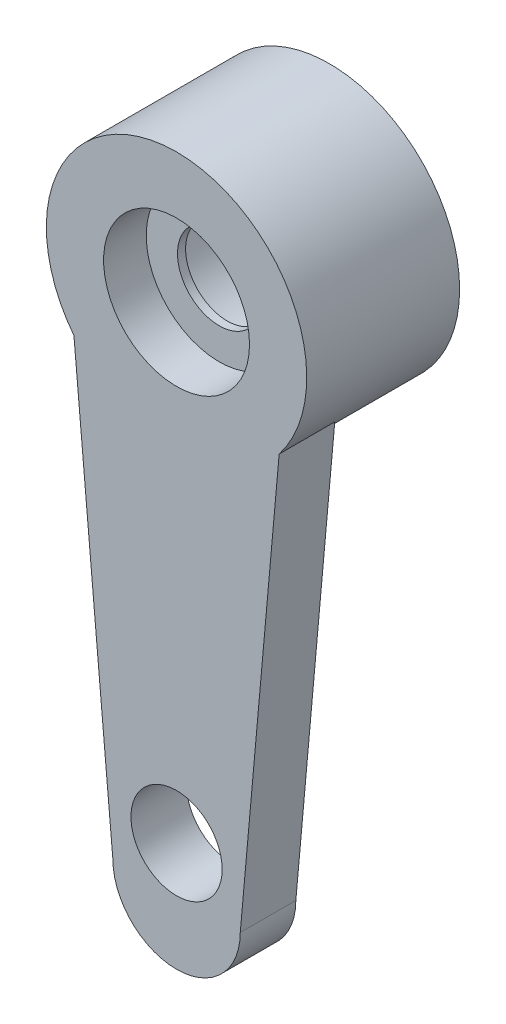
ISO-10303-21;
HEADER;
FILE_DESCRIPTION(('STEP AP214'),'2;1');
FILE_NAME('part.step','',(''),(''),'','','');
FILE_SCHEMA(('AUTOMOTIVE_DESIGN { 1 0 10303 214 1 1 1 1 }'));
ENDSEC;
DATA;
#1=APPLICATION_CONTEXT('core data for automotive mechanical design processes');
#2=APPLICATION_PROTOCOL_DEFINITION('international standard','automotive_design',2000,#1);
#3=PRODUCT_CONTEXT('',#1,'mechanical');
#4=PRODUCT('Part','Part','',(#3));
#5=PRODUCT_RELATED_PRODUCT_CATEGORY('part','',(#4));
#6=PRODUCT_DEFINITION_FORMATION('','',#4);
#7=PRODUCT_DEFINITION_CONTEXT('part definition',#1,'design');
#8=PRODUCT_DEFINITION('design','',#6,#7);
#9=PRODUCT_DEFINITION_SHAPE('','',#8);
#10=(LENGTH_UNIT() NAMED_UNIT(*) SI_UNIT(.MILLI.,.METRE.));
#11=(NAMED_UNIT(*) PLANE_ANGLE_UNIT() SI_UNIT($,.RADIAN.));
#12=(NAMED_UNIT(*) SI_UNIT($,.STERADIAN.) SOLID_ANGLE_UNIT());
#13=UNCERTAINTY_MEASURE_WITH_UNIT(LENGTH_MEASURE(1.E-05),#10,'distance_accuracy_value','');
#14=(GEOMETRIC_REPRESENTATION_CONTEXT(3) GLOBAL_UNCERTAINTY_ASSIGNED_CONTEXT((#13)) GLOBAL_UNIT_ASSIGNED_CONTEXT((#10,
#11,#12)) REPRESENTATION_CONTEXT('',''));
#15=CARTESIAN_POINT('',(0.,0.,0.));
#16=DIRECTION('',(0.,0.,1.));
#17=DIRECTION('',(1.,0.,0.));
#18=AXIS2_PLACEMENT_3D('',#15,#16,#17);
#19=CARTESIAN_POINT('',(-5.49999999999997,0.,-2.84196586235089));
#20=DIRECTION('',(0.,0.,-1.));
#21=DIRECTION('',(-1.,0.,0.));
#22=AXIS2_PLACEMENT_3D('',#19,#20,#21);
#23=CYLINDRICAL_SURFACE('',#22,2.);
#24=CARTESIAN_POINT('',(-5.49999999999997,0.,-7.03296586235089));
#25=DIRECTION('',(0.,0.,1.));
#26=DIRECTION('',(1.,0.,0.));
#27=AXIS2_PLACEMENT_3D('',#24,#25,#26);
#28=CIRCLE('',#27,2.);
#29=CARTESIAN_POINT('',(-3.49999999999996,0.,-7.03296586235089));
#30=VERTEX_POINT('',#29);
#31=EDGE_CURVE('E116',#30,#30,#28,.T.);
#32=ORIENTED_EDGE('',*,*,#31,.F.);
#33=EDGE_LOOP('',(#32));
#34=FACE_BOUND('',#33,.T.);
#35=CARTESIAN_POINT('',(-5.49999999999997,0.,-4.23296586235089));
#36=DIRECTION('',(0.,0.,1.));
#37=DIRECTION('',(1.,0.,0.));
#38=AXIS2_PLACEMENT_3D('',#35,#36,#37);
#39=CIRCLE('',#38,2.00000000000001);
#40=CARTESIAN_POINT('',(-3.49999999999996,0.,-4.23296586235089));
#41=VERTEX_POINT('',#40);
#42=EDGE_CURVE('E112',#41,#41,#39,.T.);
#43=ORIENTED_EDGE('',*,*,#42,.T.);
#44=EDGE_LOOP('',(#43));
#45=FACE_BOUND('',#44,.T.);
#46=ADVANCED_FACE('F39',(#34,#45),#23,.F.);
#47=CARTESIAN_POINT('',(-5.49999999999997,0.,-2.84196586235089));
#48=DIRECTION('',(0.,0.,1.));
#49=DIRECTION('',(1.,0.,0.));
#50=AXIS2_PLACEMENT_3D('',#47,#48,#49);
#51=PLANE('',#50);
#52=CARTESIAN_POINT('',(-5.49999999999997,0.,-2.84196586235089));
#53=DIRECTION('',(0.,0.,1.));
#54=DIRECTION('',(1.,0.,0.));
#55=AXIS2_PLACEMENT_3D('',#52,#53,#54);
#56=CIRCLE('',#55,3.5687);
#57=CARTESIAN_POINT('',(-2.68694999999995,-2.19598938692788,-2.84196586235089));
#58=VERTEX_POINT('',#57);
#59=CARTESIAN_POINT('',(-8.31304999999995,-2.1959893869279,-2.84196586235089));
#60=VERTEX_POINT('',#59);
#61=EDGE_CURVE('E47',#58,#60,#56,.T.);
#62=ORIENTED_EDGE('',*,*,#61,.T.);
#63=DIRECTION('',(0.0893287482023586,-0.996002196154506,0.));
#64=VECTOR('',#63,1.);
#65=CARTESIAN_POINT('',(-7.24624999999995,-14.09065,-2.84196586235089));
#66=LINE('',#65,#64);
#67=CARTESIAN_POINT('',(-7.24624999999995,-14.09065,-2.84196586235089));
#68=VERTEX_POINT('',#67);
#69=EDGE_CURVE('E176',#60,#68,#66,.T.);
#70=ORIENTED_EDGE('',*,*,#69,.T.);
#71=CARTESIAN_POINT('',(-5.49999999999995,-14.09065,-2.84196586235089));
#72=DIRECTION('',(0.,0.,1.));
#73=DIRECTION('',(1.,0.,0.));
#74=AXIS2_PLACEMENT_3D('',#71,#72,#73);
#75=CIRCLE('',#74,1.74625);
#76=CARTESIAN_POINT('',(-3.75374999999995,-14.09065,-2.84196586235089));
#77=VERTEX_POINT('',#76);
#78=EDGE_CURVE('E173',#68,#77,#75,.T.);
#79=ORIENTED_EDGE('',*,*,#78,.T.);
#80=DIRECTION('',(0.0893287482023584,0.996002196154506,0.));
#81=VECTOR('',#80,1.);
#82=CARTESIAN_POINT('',(-3.75374999999995,-14.09065,-2.84196586235089));
#83=LINE('',#82,#81);
#84=EDGE_CURVE('E54',#77,#58,#83,.T.);
#85=ORIENTED_EDGE('',*,*,#84,.T.);
#86=EDGE_LOOP('',(#62,#70,#79,#85));
#87=FACE_BOUND('',#86,.T.);
#88=CARTESIAN_POINT('',(-5.49999999999997,0.,-2.84196586235089));
#89=DIRECTION('',(0.,0.,1.));
#90=DIRECTION('',(1.,0.,0.));
#91=AXIS2_PLACEMENT_3D('',#88,#89,#90);
#92=CIRCLE('',#91,2.);
#93=CARTESIAN_POINT('',(-3.49999999999996,0.,-2.84196586235089));
#94=VERTEX_POINT('',#93);
#95=EDGE_CURVE('E119',#94,#94,#92,.T.);
#96=ORIENTED_EDGE('',*,*,#95,.F.);
#97=EDGE_LOOP('',(#96));
#98=FACE_BOUND('',#97,.T.);
#99=CARTESIAN_POINT('',(-5.49999999999996,-12.84065,-2.84196586235089));
#100=DIRECTION('',(0.,0.,1.));
#101=DIRECTION('',(1.,0.,0.));
#102=AXIS2_PLACEMENT_3D('',#99,#100,#101);
#103=CIRCLE('',#102,1.25);
#104=CARTESIAN_POINT('',(-4.24999999999996,-12.84065,-2.84196586235089));
#105=VERTEX_POINT('',#104);
#106=EDGE_CURVE('E168',#105,#105,#103,.T.);
#107=ORIENTED_EDGE('',*,*,#106,.F.);
#108=EDGE_LOOP('',(#107));
#109=FACE_BOUND('',#108,.T.);
#110=ADVANCED_FACE('F131',(#87,#98,#109),#51,.T.);
#111=CARTESIAN_POINT('',(-5.49999999999997,0.,-7.03296586235089));
#112=DIRECTION('',(0.,0.,1.));
#113=DIRECTION('',(1.,0.,0.));
#114=AXIS2_PLACEMENT_3D('',#111,#112,#113);
#115=PLANE('',#114);
#116=CARTESIAN_POINT('',(-5.49999999999997,0.,-7.03296586235089));
#117=DIRECTION('',(0.,0.,1.));
#118=DIRECTION('',(1.,0.,0.));
#119=AXIS2_PLACEMENT_3D('',#116,#117,#118);
#120=CIRCLE('',#119,3.5687);
#121=CARTESIAN_POINT('',(-1.93129999999997,0.,-7.03296586235089));
#122=VERTEX_POINT('',#121);
#123=EDGE_CURVE('E122',#122,#122,#120,.T.);
#124=ORIENTED_EDGE('',*,*,#123,.F.);
#125=EDGE_LOOP('',(#124));
#126=FACE_BOUND('',#125,.T.);
#127=ORIENTED_EDGE('',*,*,#31,.T.);
#128=EDGE_LOOP('',(#127));
#129=FACE_BOUND('',#128,.T.);
#130=ADVANCED_FACE('F128',(#126,#129),#115,.F.);
#131=CARTESIAN_POINT('',(-5.49999999999997,0.,-2.84196586235089));
#132=DIRECTION('',(0.,0.,-1.));
#133=DIRECTION('',(-1.,0.,0.));
#134=AXIS2_PLACEMENT_3D('',#131,#132,#133);
#135=CYLINDRICAL_SURFACE('',#134,3.5687);
#136=CARTESIAN_POINT('',(-5.49999999999995,0.,-4.36596586235089));
#137=DIRECTION('',(0.,0.,-1.));
#138=DIRECTION('',(-1.,0.,0.));
#139=AXIS2_PLACEMENT_3D('',#136,#137,#138);
#140=CIRCLE('',#139,3.5687);
#141=CARTESIAN_POINT('',(-2.68694999999995,-2.1959893869279,-4.36596586235089));
#142=VERTEX_POINT('',#141);
#143=CARTESIAN_POINT('',(-8.31304999999995,-2.1959893869279,-4.36596586235089));
#144=VERTEX_POINT('',#143);
#145=EDGE_CURVE('E89',#142,#144,#140,.T.);
#146=ORIENTED_EDGE('',*,*,#145,.T.);
#147=DIRECTION('',(0.,0.,1.));
#148=VECTOR('',#147,1.);
#149=CARTESIAN_POINT('',(-8.31304999999995,-2.1959893869279,-4.36596586235089));
#150=LINE('',#149,#148);
#151=EDGE_CURVE('E103',#144,#60,#150,.T.);
#152=ORIENTED_EDGE('',*,*,#151,.T.);
#153=ORIENTED_EDGE('',*,*,#61,.F.);
#154=DIRECTION('',(0.,0.,1.));
#155=VECTOR('',#154,1.);
#156=CARTESIAN_POINT('',(-2.68694999999995,-2.1959893869279,-4.36596586235089));
#157=LINE('',#156,#155);
#158=EDGE_CURVE('E98',#142,#58,#157,.T.);
#159=ORIENTED_EDGE('',*,*,#158,.F.);
#160=EDGE_LOOP('',(#146,#152,#153,#159));
#161=FACE_BOUND('',#160,.T.);
#162=ORIENTED_EDGE('',*,*,#123,.T.);
#163=EDGE_LOOP('',(#162));
#164=FACE_BOUND('',#163,.T.);
#165=ADVANCED_FACE('F41',(#161,#164),#135,.T.);
#166=CARTESIAN_POINT('',(-5.49999999999997,0.,-4.01036586235089));
#167=DIRECTION('',(0.,0.,1.));
#168=DIRECTION('',(1.,0.,0.));
#169=AXIS2_PLACEMENT_3D('',#166,#167,#168);
#170=CIRCLE('',#169,2.);
#171=CARTESIAN_POINT('',(-3.49999999999996,0.,-4.01036586235089));
#172=VERTEX_POINT('',#171);
#173=EDGE_CURVE('E12',#172,#172,#170,.T.);
#174=ORIENTED_EDGE('',*,*,#173,.F.);
#175=EDGE_LOOP('',(#174));
#176=FACE_BOUND('',#175,.T.);
#177=ORIENTED_EDGE('',*,*,#95,.T.);
#178=EDGE_LOOP('',(#177));
#179=FACE_BOUND('',#178,.T.);
#180=ADVANCED_FACE('F137',(#176,#179),#23,.F.);
#181=CARTESIAN_POINT('',(-5.49999999999997,0.,-4.23296586235089));
#182=DIRECTION('',(0.,0.,1.));
#183=DIRECTION('',(1.,0.,0.));
#184=AXIS2_PLACEMENT_3D('',#181,#182,#183);
#185=PLANE('',#184);
#186=ORIENTED_EDGE('',*,*,#42,.F.);
#187=EDGE_LOOP('',(#186));
#188=FACE_BOUND('',#187,.T.);
#189=CARTESIAN_POINT('',(-5.49999999999997,0.,-4.23296586235089));
#190=DIRECTION('',(0.,0.,1.));
#191=DIRECTION('',(1.,0.,0.));
#192=AXIS2_PLACEMENT_3D('',#189,#190,#191);
#193=CIRCLE('',#192,1.14300000000001);
#194=CARTESIAN_POINT('',(-4.35699999999996,0.,-4.23296586235089));
#195=VERTEX_POINT('',#194);
#196=EDGE_CURVE('E109',#195,#195,#193,.T.);
#197=ORIENTED_EDGE('',*,*,#196,.T.);
#198=EDGE_LOOP('',(#197));
#199=FACE_BOUND('',#198,.T.);
#200=ADVANCED_FACE('F140',(#188,#199),#185,.F.);
#201=CARTESIAN_POINT('',(-5.49999999999997,0.,2.81488838714151));
#202=DIRECTION('',(0.,0.,-1.));
#203=DIRECTION('',(-1.,0.,0.));
#204=AXIS2_PLACEMENT_3D('',#201,#202,#203);
#205=CYLINDRICAL_SURFACE('',#204,1.14300000000001);
#206=ORIENTED_EDGE('',*,*,#196,.F.);
#207=EDGE_LOOP('',(#206));
#208=FACE_BOUND('',#207,.T.);
#209=CARTESIAN_POINT('',(-5.49999999999997,0.,-4.01036586235089));
#210=DIRECTION('',(0.,0.,1.));
#211=DIRECTION('',(1.,0.,0.));
#212=AXIS2_PLACEMENT_3D('',#209,#210,#211);
#213=CIRCLE('',#212,1.14300000000001);
#214=CARTESIAN_POINT('',(-4.35699999999996,0.,-4.01036586235089));
#215=VERTEX_POINT('',#214);
#216=EDGE_CURVE('E113',#215,#215,#213,.T.);
#217=ORIENTED_EDGE('',*,*,#216,.T.);
#218=EDGE_LOOP('',(#217));
#219=FACE_BOUND('',#218,.T.);
#220=ADVANCED_FACE('F143',(#208,#219),#205,.F.);
#221=CARTESIAN_POINT('',(-5.49999999999997,0.,-4.01036586235089));
#222=DIRECTION('',(0.,0.,1.));
#223=DIRECTION('',(1.,0.,0.));
#224=AXIS2_PLACEMENT_3D('',#221,#222,#223);
#225=PLANE('',#224);
#226=ORIENTED_EDGE('',*,*,#216,.F.);
#227=EDGE_LOOP('',(#226));
#228=FACE_BOUND('',#227,.T.);
#229=ORIENTED_EDGE('',*,*,#173,.T.);
#230=EDGE_LOOP('',(#229));
#231=FACE_BOUND('',#230,.T.);
#232=ADVANCED_FACE('F149',(#228,#231),#225,.T.);
#233=CARTESIAN_POINT('',(-5.49999999999995,-14.09065,-4.36596586235089));
#234=DIRECTION('',(0.,0.,1.));
#235=DIRECTION('',(1.,0.,0.));
#236=AXIS2_PLACEMENT_3D('',#233,#234,#235);
#237=CYLINDRICAL_SURFACE('',#236,1.74625);
#238=ORIENTED_EDGE('',*,*,#78,.F.);
#239=DIRECTION('',(0.,0.,1.));
#240=VECTOR('',#239,1.);
#241=CARTESIAN_POINT('',(-7.24624999999995,-14.09065,-4.36596586235089));
#242=LINE('',#241,#240);
#243=CARTESIAN_POINT('',(-7.24624999999995,-14.09065,-4.36596586235089));
#244=VERTEX_POINT('',#243);
#245=EDGE_CURVE('E63',#244,#68,#242,.T.);
#246=ORIENTED_EDGE('',*,*,#245,.F.);
#247=CARTESIAN_POINT('',(-5.49999999999995,-14.09065,-4.36596586235089));
#248=DIRECTION('',(0.,0.,1.));
#249=DIRECTION('',(1.,0.,0.));
#250=AXIS2_PLACEMENT_3D('',#247,#248,#249);
#251=CIRCLE('',#250,1.74625);
#252=CARTESIAN_POINT('',(-3.75374999999995,-14.09065,-4.36596586235089));
#253=VERTEX_POINT('',#252);
#254=EDGE_CURVE('E100',#244,#253,#251,.T.);
#255=ORIENTED_EDGE('',*,*,#254,.T.);
#256=DIRECTION('',(0.,0.,1.));
#257=VECTOR('',#256,1.);
#258=CARTESIAN_POINT('',(-3.75374999999995,-14.09065,-4.36596586235089));
#259=LINE('',#258,#257);
#260=EDGE_CURVE('E83',#253,#77,#259,.T.);
#261=ORIENTED_EDGE('',*,*,#260,.T.);
#262=EDGE_LOOP('',(#238,#246,#255,#261));
#263=FACE_BOUND('',#262,.T.);
#264=ADVANCED_FACE('F155',(#263),#237,.T.);
#265=CARTESIAN_POINT('',(-7.24624999999995,-14.09065,-4.36596586235089));
#266=DIRECTION('',(-0.996002196154506,-0.0893287482023586,0.));
#267=DIRECTION('',(0.0893287482023586,-0.996002196154506,0.));
#268=AXIS2_PLACEMENT_3D('',#265,#266,#267);
#269=PLANE('',#268);
#270=ORIENTED_EDGE('',*,*,#69,.F.);
#271=ORIENTED_EDGE('',*,*,#151,.F.);
#272=DIRECTION('',(0.0893287482023586,-0.996002196154506,0.));
#273=VECTOR('',#272,1.);
#274=CARTESIAN_POINT('',(-7.24624999999995,-14.09065,-4.36596586235089));
#275=LINE('',#274,#273);
#276=EDGE_CURVE('E92',#144,#244,#275,.T.);
#277=ORIENTED_EDGE('',*,*,#276,.T.);
#278=ORIENTED_EDGE('',*,*,#245,.T.);
#279=EDGE_LOOP('',(#270,#271,#277,#278));
#280=FACE_BOUND('',#279,.T.);
#281=ADVANCED_FACE('F182',(#280),#269,.T.);
#282=CARTESIAN_POINT('',(-3.75374999999995,-14.09065,-4.36596586235089));
#283=DIRECTION('',(0.996002196154506,-0.0893287482023584,0.));
#284=DIRECTION('',(0.0893287482023584,0.996002196154506,0.));
#285=AXIS2_PLACEMENT_3D('',#282,#283,#284);
#286=PLANE('',#285);
#287=ORIENTED_EDGE('',*,*,#84,.F.);
#288=ORIENTED_EDGE('',*,*,#260,.F.);
#289=DIRECTION('',(0.0893287482023584,0.996002196154506,0.));
#290=VECTOR('',#289,1.);
#291=CARTESIAN_POINT('',(-3.75374999999995,-14.09065,-4.36596586235089));
#292=LINE('',#291,#290);
#293=EDGE_CURVE('E91',#253,#142,#292,.T.);
#294=ORIENTED_EDGE('',*,*,#293,.T.);
#295=ORIENTED_EDGE('',*,*,#158,.T.);
#296=EDGE_LOOP('',(#287,#288,#294,#295));
#297=FACE_BOUND('',#296,.T.);
#298=ADVANCED_FACE('F97',(#297),#286,.T.);
#299=CARTESIAN_POINT('',(-5.49999999999995,-14.09065,-4.36596586235089));
#300=DIRECTION('',(0.,0.,1.));
#301=DIRECTION('',(1.,0.,0.));
#302=AXIS2_PLACEMENT_3D('',#299,#300,#301);
#303=PLANE('',#302);
#304=CARTESIAN_POINT('',(-5.49999999999996,-12.84065,-4.36596586235089));
#305=DIRECTION('',(0.,0.,1.));
#306=DIRECTION('',(1.,0.,0.));
#307=AXIS2_PLACEMENT_3D('',#304,#305,#306);
#308=CIRCLE('',#307,1.25);
#309=CARTESIAN_POINT('',(-4.24999999999996,-12.84065,-4.36596586235089));
#310=VERTEX_POINT('',#309);
#311=EDGE_CURVE('E170',#310,#310,#308,.T.);
#312=ORIENTED_EDGE('',*,*,#311,.T.);
#313=EDGE_LOOP('',(#312));
#314=FACE_BOUND('',#313,.T.);
#315=ORIENTED_EDGE('',*,*,#254,.F.);
#316=ORIENTED_EDGE('',*,*,#276,.F.);
#317=ORIENTED_EDGE('',*,*,#145,.F.);
#318=ORIENTED_EDGE('',*,*,#293,.F.);
#319=EDGE_LOOP('',(#315,#316,#317,#318));
#320=FACE_BOUND('',#319,.T.);
#321=ADVANCED_FACE('F90',(#314,#320),#303,.F.);
#322=CARTESIAN_POINT('',(-5.49999999999996,-12.84065,-4.36596586235089));
#323=DIRECTION('',(0.,0.,1.));
#324=DIRECTION('',(1.,0.,0.));
#325=AXIS2_PLACEMENT_3D('',#322,#323,#324);
#326=CYLINDRICAL_SURFACE('',#325,1.25);
#327=CARTESIAN_POINT('',(-4.24999999999996,-12.84065,-4.36596586235089));
#328=CARTESIAN_POINT('',(-4.24999999999996,-12.84065,-4.35009086235089));
#329=CARTESIAN_POINT('',(-4.24999999999996,-12.84065,-4.33421586235089));
#330=CARTESIAN_POINT('',(-4.24999999999996,-12.84065,-4.30246586235089));
#331=CARTESIAN_POINT('',(-4.24999999999996,-12.84065,-4.28659086235089));
#332=CARTESIAN_POINT('',(-4.24999999999996,-12.84065,-4.25484086235089));
#333=CARTESIAN_POINT('',(-4.24999999999996,-12.84065,-4.23896586235089));
#334=CARTESIAN_POINT('',(-4.24999999999996,-12.84065,-4.20721586235089));
#335=CARTESIAN_POINT('',(-4.24999999999996,-12.84065,-4.19134086235089));
#336=CARTESIAN_POINT('',(-4.24999999999996,-12.84065,-4.15959086235089));
#337=CARTESIAN_POINT('',(-4.24999999999996,-12.84065,-4.14371586235089));
#338=CARTESIAN_POINT('',(-4.24999999999996,-12.84065,-4.11196586235089));
#339=CARTESIAN_POINT('',(-4.24999999999996,-12.84065,-4.09609086235089));
#340=CARTESIAN_POINT('',(-4.24999999999996,-12.84065,-4.06434086235089));
#341=CARTESIAN_POINT('',(-4.24999999999996,-12.84065,-4.04846586235089));
#342=CARTESIAN_POINT('',(-4.24999999999996,-12.84065,-4.01671586235089));
#343=CARTESIAN_POINT('',(-4.24999999999996,-12.84065,-4.00084086235089));
#344=CARTESIAN_POINT('',(-4.24999999999996,-12.84065,-3.96909086235089));
#345=CARTESIAN_POINT('',(-4.24999999999996,-12.84065,-3.95321586235089));
#346=CARTESIAN_POINT('',(-4.24999999999996,-12.84065,-3.92146586235089));
#347=CARTESIAN_POINT('',(-4.24999999999996,-12.84065,-3.90559086235089));
#348=CARTESIAN_POINT('',(-4.24999999999996,-12.84065,-3.87384086235089));
#349=CARTESIAN_POINT('',(-4.24999999999996,-12.84065,-3.85796586235089));
#350=CARTESIAN_POINT('',(-4.24999999999996,-12.84065,-3.82621586235089));
#351=CARTESIAN_POINT('',(-4.24999999999996,-12.84065,-3.81034086235089));
#352=CARTESIAN_POINT('',(-4.24999999999996,-12.84065,-3.77859086235089));
#353=CARTESIAN_POINT('',(-4.24999999999996,-12.84065,-3.76271586235089));
#354=CARTESIAN_POINT('',(-4.24999999999996,-12.84065,-3.73096586235089));
#355=CARTESIAN_POINT('',(-4.24999999999996,-12.84065,-3.71509086235089));
#356=CARTESIAN_POINT('',(-4.24999999999996,-12.84065,-3.68334086235089));
#357=CARTESIAN_POINT('',(-4.24999999999996,-12.84065,-3.66746586235089));
#358=CARTESIAN_POINT('',(-4.24999999999996,-12.84065,-3.63571586235089));
#359=CARTESIAN_POINT('',(-4.24999999999996,-12.84065,-3.61984086235089));
#360=CARTESIAN_POINT('',(-4.24999999999996,-12.84065,-3.58809086235089));
#361=CARTESIAN_POINT('',(-4.24999999999996,-12.84065,-3.57221586235089));
#362=CARTESIAN_POINT('',(-4.24999999999996,-12.84065,-3.54046586235089));
#363=CARTESIAN_POINT('',(-4.24999999999996,-12.84065,-3.52459086235089));
#364=CARTESIAN_POINT('',(-4.24999999999996,-12.84065,-3.49284086235089));
#365=CARTESIAN_POINT('',(-4.24999999999996,-12.84065,-3.47696586235089));
#366=CARTESIAN_POINT('',(-4.24999999999996,-12.84065,-3.44521586235089));
#367=CARTESIAN_POINT('',(-4.24999999999996,-12.84065,-3.42934086235089));
#368=CARTESIAN_POINT('',(-4.24999999999996,-12.84065,-3.39759086235089));
#369=CARTESIAN_POINT('',(-4.24999999999996,-12.84065,-3.38171586235089));
#370=CARTESIAN_POINT('',(-4.24999999999996,-12.84065,-3.34996586235089));
#371=CARTESIAN_POINT('',(-4.24999999999996,-12.84065,-3.33409086235089));
#372=CARTESIAN_POINT('',(-4.24999999999996,-12.84065,-3.30234086235089));
#373=CARTESIAN_POINT('',(-4.24999999999996,-12.84065,-3.28646586235089));
#374=CARTESIAN_POINT('',(-4.24999999999996,-12.84065,-3.25471586235089));
#375=CARTESIAN_POINT('',(-4.24999999999996,-12.84065,-3.23884086235089));
#376=CARTESIAN_POINT('',(-4.24999999999996,-12.84065,-3.20709086235089));
#377=CARTESIAN_POINT('',(-4.24999999999996,-12.84065,-3.19121586235089));
#378=CARTESIAN_POINT('',(-4.24999999999996,-12.84065,-3.15946586235089));
#379=CARTESIAN_POINT('',(-4.24999999999996,-12.84065,-3.14359086235089));
#380=CARTESIAN_POINT('',(-4.24999999999996,-12.84065,-3.11184086235089));
#381=CARTESIAN_POINT('',(-4.24999999999996,-12.84065,-3.09596586235089));
#382=CARTESIAN_POINT('',(-4.24999999999996,-12.84065,-3.06421586235089));
#383=CARTESIAN_POINT('',(-4.24999999999996,-12.84065,-3.04834086235089));
#384=CARTESIAN_POINT('',(-4.24999999999996,-12.84065,-3.01659086235089));
#385=CARTESIAN_POINT('',(-4.24999999999996,-12.84065,-3.00071586235089));
#386=CARTESIAN_POINT('',(-4.24999999999996,-12.84065,-2.96896586235089));
#387=CARTESIAN_POINT('',(-4.24999999999996,-12.84065,-2.95309086235089));
#388=CARTESIAN_POINT('',(-4.24999999999996,-12.84065,-2.92134086235089));
#389=CARTESIAN_POINT('',(-4.24999999999996,-12.84065,-2.90546586235089));
#390=CARTESIAN_POINT('',(-4.24999999999996,-12.84065,-2.87371586235089));
#391=CARTESIAN_POINT('',(-4.24999999999996,-12.84065,-2.85784086235089));
#392=CARTESIAN_POINT('',(-4.24999999999996,-12.84065,-2.84196586235089));
#393=B_SPLINE_CURVE_WITH_KNOTS('',3,(#327,#328,#329,#330,#331,#332,#333,#334,#335,#336,#337,
#338,#339,#340,#341,#342,#343,#344,#345,#346,#347,#348,#349,#350,#351,#352,#353,#354,#355,#356,
#357,#358,#359,#360,#361,#362,#363,#364,#365,#366,#367,#368,#369,#370,#371,#372,#373,#374,#375,
#376,#377,#378,#379,#380,#381,#382,#383,#384,#385,#386,#387,#388,#389,#390,#391,#392),
.UNSPECIFIED.,.F.,.F.,(4,2,2,2,2,2,2,2,2,2,2,2,2,2,2,2,2,2,2,2,2,2,2,2,2,2,2,2,2,2,2,2,4),(0.,
0.0476249999999999,0.0952499999999998,0.142875,0.1905,0.238125,0.28575,0.333374999999999,
0.380999999999999,0.428624999999999,0.47625,0.523875,0.5715,0.619125,0.66675,0.714375,0.762,
0.809625,0.85725,0.904875,0.9525,1.000125,1.04775,1.095375,1.143,1.190625,1.23825,1.285875,
1.3335,1.381125,1.42875,1.476375,1.524),.UNSPECIFIED.);
#394=EDGE_CURVE('BSEAM194',#310,#105,#393,.T.);
#395=ORIENTED_EDGE('',*,*,#311,.F.);
#396=ORIENTED_EDGE('',*,*,#106,.T.);
#397=ORIENTED_EDGE('',*,*,#394,.T.);
#398=ORIENTED_EDGE('',*,*,#394,.F.);
#399=EDGE_LOOP('',(#395,#397,#396,#398));
#400=FACE_BOUND('',#399,.T.);
#401=ADVANCED_FACE('F194',(#400),#326,.F.);
#402=CLOSED_SHELL('',(#46,#110,#130,#165,#180,#200,#220,#232,#264,#281,#298,#321,#401));
#403=MANIFOLD_SOLID_BREP('B2',#402);
#404=ADVANCED_BREP_SHAPE_REPRESENTATION('',(#18,#403),#14);
#405=SHAPE_DEFINITION_REPRESENTATION(#9,#404);
ENDSEC;
END-ISO-10303-21;
